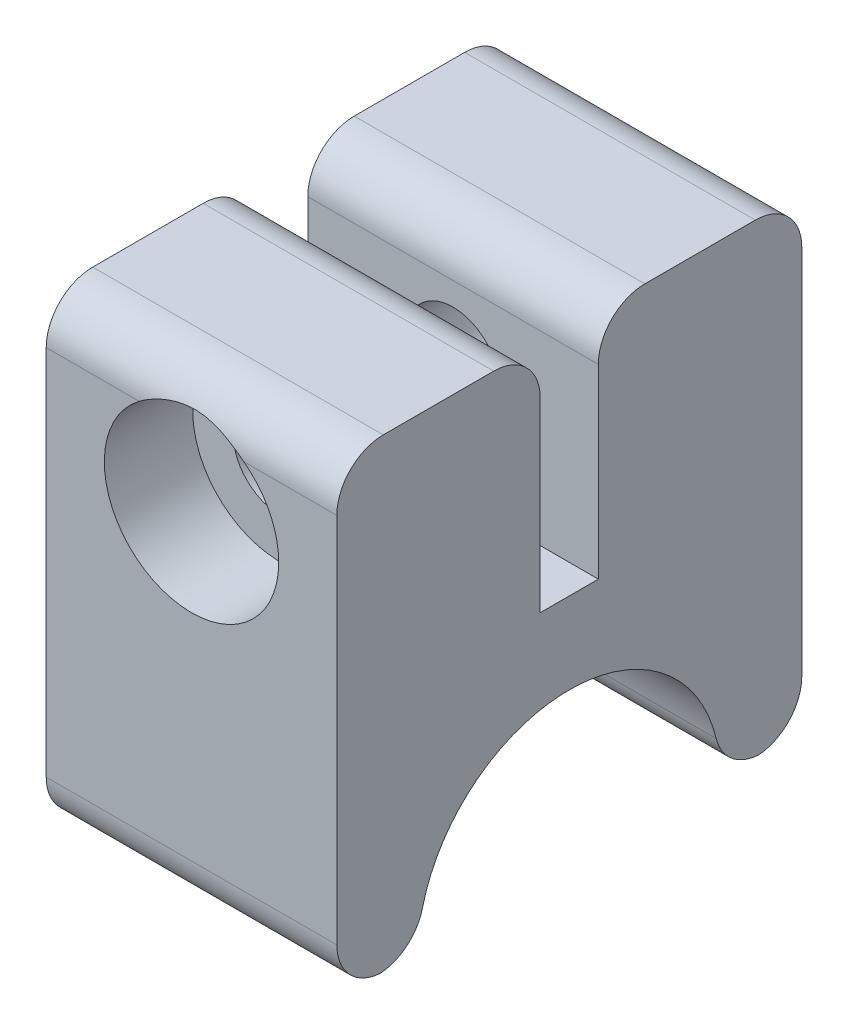
ISO-10303-21;
HEADER;
FILE_DESCRIPTION(('STEP AP214'),'2;1');
FILE_NAME('part.step','',(''),(''),'','','');
FILE_SCHEMA(('AUTOMOTIVE_DESIGN { 1 0 10303 214 1 1 1 1 }'));
ENDSEC;
DATA;
#1=APPLICATION_CONTEXT('core data for automotive mechanical design processes');
#2=APPLICATION_PROTOCOL_DEFINITION('international standard','automotive_design',2000,#1);
#3=PRODUCT_CONTEXT('',#1,'mechanical');
#4=PRODUCT('Part','Part','',(#3));
#5=PRODUCT_RELATED_PRODUCT_CATEGORY('part','',(#4));
#6=PRODUCT_DEFINITION_FORMATION('','',#4);
#7=PRODUCT_DEFINITION_CONTEXT('part definition',#1,'design');
#8=PRODUCT_DEFINITION('design','',#6,#7);
#9=PRODUCT_DEFINITION_SHAPE('','',#8);
#10=(LENGTH_UNIT() NAMED_UNIT(*) SI_UNIT(.MILLI.,.METRE.));
#11=(NAMED_UNIT(*) PLANE_ANGLE_UNIT() SI_UNIT($,.RADIAN.));
#12=(NAMED_UNIT(*) SI_UNIT($,.STERADIAN.) SOLID_ANGLE_UNIT());
#13=UNCERTAINTY_MEASURE_WITH_UNIT(LENGTH_MEASURE(1.E-05),#10,'distance_accuracy_value','');
#14=(GEOMETRIC_REPRESENTATION_CONTEXT(3) GLOBAL_UNCERTAINTY_ASSIGNED_CONTEXT((#13)) GLOBAL_UNIT_ASSIGNED_CONTEXT((#10,
#11,#12)) REPRESENTATION_CONTEXT('',''));
#15=CARTESIAN_POINT('',(0.,0.,0.));
#16=DIRECTION('',(0.,0.,1.));
#17=DIRECTION('',(1.,0.,0.));
#18=AXIS2_PLACEMENT_3D('',#15,#16,#17);
#19=CARTESIAN_POINT('',(0.,6.35,12.7));
#20=DIRECTION('',(0.,0.,1.));
#21=DIRECTION('',(1.,0.,0.));
#22=AXIS2_PLACEMENT_3D('',#19,#20,#21);
#23=CYLINDRICAL_SURFACE('',#22,2.5527);
#24=CARTESIAN_POINT('',(0.,6.35,-1.5875));
#25=DIRECTION('',(0.,0.,-1.));
#26=DIRECTION('',(-1.,0.,0.));
#27=AXIS2_PLACEMENT_3D('',#24,#25,#26);
#28=CIRCLE('',#27,2.5527);
#29=CARTESIAN_POINT('',(-2.5527,6.35,-1.5875));
#30=VERTEX_POINT('',#29);
#31=EDGE_CURVE('E262',#30,#30,#28,.T.);
#32=ORIENTED_EDGE('',*,*,#31,.F.);
#33=EDGE_LOOP('',(#32));
#34=FACE_BOUND('',#33,.T.);
#35=CARTESIAN_POINT('',(0.,6.35,-6.492875));
#36=DIRECTION('',(0.,0.,-1.));
#37=DIRECTION('',(-1.,0.,0.));
#38=AXIS2_PLACEMENT_3D('',#35,#36,#37);
#39=CIRCLE('',#38,2.5527);
#40=CARTESIAN_POINT('',(-2.5527,6.35,-6.492875));
#41=VERTEX_POINT('',#40);
#42=EDGE_CURVE('E41',#41,#41,#39,.F.);
#43=ORIENTED_EDGE('',*,*,#42,.F.);
#44=EDGE_LOOP('',(#43));
#45=FACE_BOUND('',#44,.T.);
#46=ADVANCED_FACE('F37',(#34,#45),#23,.F.);
#47=CARTESIAN_POINT('',(-7.9375,12.7,12.7));
#48=DIRECTION('',(0.,-1.,0.));
#49=DIRECTION('',(0.,0.,-1.));
#50=AXIS2_PLACEMENT_3D('',#47,#48,#49);
#51=PLANE('',#50);
#52=DIRECTION('',(0.,0.,-1.));
#53=VECTOR('',#52,1.);
#54=CARTESIAN_POINT('',(-7.9375,12.7,12.7));
#55=LINE('',#54,#53);
#56=CARTESIAN_POINT('',(-7.9375,12.7,10.16));
#57=VERTEX_POINT('',#56);
#58=CARTESIAN_POINT('',(-7.9375,12.7,4.1275));
#59=VERTEX_POINT('',#58);
#60=EDGE_CURVE('E308',#57,#59,#55,.T.);
#61=ORIENTED_EDGE('',*,*,#60,.F.);
#62=DIRECTION('',(-1.,0.,0.));
#63=VECTOR('',#62,1.);
#64=CARTESIAN_POINT('',(-7.9375,12.7,10.16));
#65=LINE('',#64,#63);
#66=CARTESIAN_POINT('',(7.9375,12.7,10.16));
#67=VERTEX_POINT('',#66);
#68=EDGE_CURVE('E470',#57,#67,#65,.F.);
#69=ORIENTED_EDGE('',*,*,#68,.T.);
#70=DIRECTION('',(0.,0.,-1.));
#71=VECTOR('',#70,1.);
#72=CARTESIAN_POINT('',(7.9375,12.7,12.7));
#73=LINE('',#72,#71);
#74=CARTESIAN_POINT('',(7.9375,12.7,4.1275));
#75=VERTEX_POINT('',#74);
#76=EDGE_CURVE('E312',#67,#75,#73,.T.);
#77=ORIENTED_EDGE('',*,*,#76,.T.);
#78=DIRECTION('',(1.,0.,0.));
#79=VECTOR('',#78,1.);
#80=CARTESIAN_POINT('',(-7.9375,12.7,4.1275));
#81=LINE('',#80,#79);
#82=EDGE_CURVE('E468',#75,#59,#81,.F.);
#83=ORIENTED_EDGE('',*,*,#82,.T.);
#84=EDGE_LOOP('',(#61,#69,#77,#83));
#85=FACE_BOUND('',#84,.T.);
#86=ADVANCED_FACE('F384',(#85),#51,.F.);
#87=CARTESIAN_POINT('',(7.9375,-12.7,12.7));
#88=DIRECTION('',(-1.,0.,0.));
#89=DIRECTION('',(0.,0.,1.));
#90=AXIS2_PLACEMENT_3D('',#87,#88,#89);
#91=PLANE('',#90);
#92=ORIENTED_EDGE('',*,*,#76,.F.);
#93=CARTESIAN_POINT('',(7.9375,10.16,10.16));
#94=DIRECTION('',(-1.,0.,0.));
#95=DIRECTION('',(0.,0.,1.));
#96=AXIS2_PLACEMENT_3D('',#93,#94,#95);
#97=CIRCLE('',#96,2.54);
#98=CARTESIAN_POINT('',(7.9375,10.16,12.7));
#99=VERTEX_POINT('',#98);
#100=EDGE_CURVE('E484',#67,#99,#97,.F.);
#101=ORIENTED_EDGE('',*,*,#100,.T.);
#102=DIRECTION('',(0.,1.,0.));
#103=VECTOR('',#102,1.);
#104=CARTESIAN_POINT('',(7.9375,-12.7,12.7));
#105=LINE('',#104,#103);
#106=CARTESIAN_POINT('',(7.9375,-10.16,12.7));
#107=VERTEX_POINT('',#106);
#108=EDGE_CURVE('E294',#107,#99,#105,.T.);
#109=ORIENTED_EDGE('',*,*,#108,.F.);
#110=CARTESIAN_POINT('',(7.9375,-10.16,10.16));
#111=DIRECTION('',(-1.,0.,0.));
#112=DIRECTION('',(0.,0.,1.));
#113=AXIS2_PLACEMENT_3D('',#110,#111,#112);
#114=CIRCLE('',#113,2.54);
#115=CARTESIAN_POINT('',(7.9375,-12.6945723434746,10.32596094629));
#116=VERTEX_POINT('',#115);
#117=EDGE_CURVE('E61',#107,#116,#114,.F.);
#118=ORIENTED_EDGE('',*,*,#117,.T.);
#119=CARTESIAN_POINT('',(7.9375,-10.16,10.49192189258));
#120=DIRECTION('',(-1.,0.,0.));
#121=DIRECTION('',(0.,0.,1.));
#122=AXIS2_PLACEMENT_3D('',#119,#120,#121);
#123=CIRCLE('',#122,2.54);
#124=CARTESIAN_POINT('',(7.9375,-10.7576470588235,8.02323438844355));
#125=VERTEX_POINT('',#124);
#126=EDGE_CURVE('E476',#116,#125,#123,.F.);
#127=ORIENTED_EDGE('',*,*,#126,.T.);
#128=CARTESIAN_POINT('',(7.9375,-12.7,0.));
#129=DIRECTION('',(1.,0.,0.));
#130=DIRECTION('',(0.,0.,-1.));
#131=AXIS2_PLACEMENT_3D('',#128,#129,#130);
#132=CIRCLE('',#131,8.255);
#133=CARTESIAN_POINT('',(7.9375,-10.7576470588235,-8.02323438844355));
#134=VERTEX_POINT('',#133);
#135=EDGE_CURVE('E280',#134,#125,#132,.T.);
#136=ORIENTED_EDGE('',*,*,#135,.F.);
#137=CARTESIAN_POINT('',(7.9375,-10.16,-10.49192189258));
#138=DIRECTION('',(-1.,0.,0.));
#139=DIRECTION('',(0.,0.,1.));
#140=AXIS2_PLACEMENT_3D('',#137,#138,#139);
#141=CIRCLE('',#140,2.54);
#142=CARTESIAN_POINT('',(7.9375,-12.6945723434746,-10.32596094629));
#143=VERTEX_POINT('',#142);
#144=EDGE_CURVE('E472',#134,#143,#141,.F.);
#145=ORIENTED_EDGE('',*,*,#144,.T.);
#146=CARTESIAN_POINT('',(7.9375,-10.16,-10.16));
#147=DIRECTION('',(-1.,0.,0.));
#148=DIRECTION('',(0.,0.,1.));
#149=AXIS2_PLACEMENT_3D('',#146,#147,#148);
#150=CIRCLE('',#149,2.54);
#151=CARTESIAN_POINT('',(7.9375,-10.16,-12.7));
#152=VERTEX_POINT('',#151);
#153=EDGE_CURVE('E474',#143,#152,#150,.F.);
#154=ORIENTED_EDGE('',*,*,#153,.T.);
#155=DIRECTION('',(0.,1.,0.));
#156=VECTOR('',#155,1.);
#157=CARTESIAN_POINT('',(7.9375,-12.7,-12.7));
#158=LINE('',#157,#156);
#159=CARTESIAN_POINT('',(7.9375,10.16,-12.7));
#160=VERTEX_POINT('',#159);
#161=EDGE_CURVE('E287',#152,#160,#158,.T.);
#162=ORIENTED_EDGE('',*,*,#161,.T.);
#163=CARTESIAN_POINT('',(7.9375,10.16,-10.16));
#164=DIRECTION('',(-1.,0.,0.));
#165=DIRECTION('',(0.,0.,1.));
#166=AXIS2_PLACEMENT_3D('',#163,#164,#165);
#167=CIRCLE('',#166,2.54);
#168=CARTESIAN_POINT('',(7.9375,12.7,-10.16));
#169=VERTEX_POINT('',#168);
#170=EDGE_CURVE('E426',#160,#169,#167,.F.);
#171=ORIENTED_EDGE('',*,*,#170,.T.);
#172=CARTESIAN_POINT('',(7.9375,12.7,-4.1275));
#173=VERTEX_POINT('',#172);
#174=EDGE_CURVE('E309',#173,#169,#73,.T.);
#175=ORIENTED_EDGE('',*,*,#174,.F.);
#176=CARTESIAN_POINT('',(7.9375,10.16,-4.1275));
#177=DIRECTION('',(-1.,0.,0.));
#178=DIRECTION('',(0.,0.,1.));
#179=AXIS2_PLACEMENT_3D('',#176,#177,#178);
#180=CIRCLE('',#179,2.54);
#181=CARTESIAN_POINT('',(7.9375,10.16,-1.5875));
#182=VERTEX_POINT('',#181);
#183=EDGE_CURVE('E481',#173,#182,#180,.F.);
#184=ORIENTED_EDGE('',*,*,#183,.T.);
#185=DIRECTION('',(0.,1.,0.));
#186=VECTOR('',#185,1.);
#187=CARTESIAN_POINT('',(7.9375,12.7,-1.5875));
#188=LINE('',#187,#186);
#189=CARTESIAN_POINT('',(7.9375,0.,-1.5875));
#190=VERTEX_POINT('',#189);
#191=EDGE_CURVE('E270',#190,#182,#188,.T.);
#192=ORIENTED_EDGE('',*,*,#191,.F.);
#193=DIRECTION('',(0.,0.,-1.));
#194=VECTOR('',#193,1.);
#195=CARTESIAN_POINT('',(7.9375,0.,1.5875));
#196=LINE('',#195,#194);
#197=CARTESIAN_POINT('',(7.9375,0.,1.5875));
#198=VERTEX_POINT('',#197);
#199=EDGE_CURVE('E279',#198,#190,#196,.T.);
#200=ORIENTED_EDGE('',*,*,#199,.F.);
#201=DIRECTION('',(0.,-1.,0.));
#202=VECTOR('',#201,1.);
#203=CARTESIAN_POINT('',(7.9375,12.7,1.5875));
#204=LINE('',#203,#202);
#205=CARTESIAN_POINT('',(7.9375,10.16,1.5875));
#206=VERTEX_POINT('',#205);
#207=EDGE_CURVE('E277',#206,#198,#204,.T.);
#208=ORIENTED_EDGE('',*,*,#207,.F.);
#209=CARTESIAN_POINT('',(7.9375,10.16,4.1275));
#210=DIRECTION('',(-1.,0.,0.));
#211=DIRECTION('',(0.,0.,1.));
#212=AXIS2_PLACEMENT_3D('',#209,#210,#211);
#213=CIRCLE('',#212,2.54);
#214=EDGE_CURVE('E479',#206,#75,#213,.F.);
#215=ORIENTED_EDGE('',*,*,#214,.T.);
#216=EDGE_LOOP('',(#92,#101,#109,#118,#127,#136,#145,#154,#162,#171,#175,#184,#192,#200,#208,#215));
#217=FACE_BOUND('',#216,.T.);
#218=ADVANCED_FACE('F382',(#217),#91,.F.);
#219=ORIENTED_EDGE('',*,*,#174,.T.);
#220=DIRECTION('',(-1.,0.,0.));
#221=VECTOR('',#220,1.);
#222=CARTESIAN_POINT('',(-7.9375,12.7,-10.16));
#223=LINE('',#222,#221);
#224=CARTESIAN_POINT('',(-7.9375,12.7,-10.16));
#225=VERTEX_POINT('',#224);
#226=EDGE_CURVE('E434',#169,#225,#223,.T.);
#227=ORIENTED_EDGE('',*,*,#226,.T.);
#228=CARTESIAN_POINT('',(-7.9375,12.7,-4.1275));
#229=VERTEX_POINT('',#228);
#230=EDGE_CURVE('E301',#229,#225,#55,.T.);
#231=ORIENTED_EDGE('',*,*,#230,.F.);
#232=DIRECTION('',(1.,0.,0.));
#233=VECTOR('',#232,1.);
#234=CARTESIAN_POINT('',(-7.9375,12.7,-4.1275));
#235=LINE('',#234,#233);
#236=EDGE_CURVE('E486',#229,#173,#235,.T.);
#237=ORIENTED_EDGE('',*,*,#236,.T.);
#238=EDGE_LOOP('',(#219,#227,#231,#237));
#239=FACE_BOUND('',#238,.T.);
#240=ADVANCED_FACE('F379',(#239),#51,.F.);
#241=CARTESIAN_POINT('',(-7.9375,-12.7,12.7));
#242=DIRECTION('',(1.,0.,0.));
#243=DIRECTION('',(0.,0.,-1.));
#244=AXIS2_PLACEMENT_3D('',#241,#242,#243);
#245=PLANE('',#244);
#246=DIRECTION('',(0.,-1.,0.));
#247=VECTOR('',#246,1.);
#248=CARTESIAN_POINT('',(-7.9375,-12.7,12.7));
#249=LINE('',#248,#247);
#250=CARTESIAN_POINT('',(-7.9375,10.16,12.7));
#251=VERTEX_POINT('',#250);
#252=CARTESIAN_POINT('',(-7.9375,-10.16,12.7));
#253=VERTEX_POINT('',#252);
#254=EDGE_CURVE('E297',#251,#253,#249,.T.);
#255=ORIENTED_EDGE('',*,*,#254,.F.);
#256=CARTESIAN_POINT('',(-7.9375,10.16,10.16));
#257=DIRECTION('',(1.,0.,0.));
#258=DIRECTION('',(0.,0.,-1.));
#259=AXIS2_PLACEMENT_3D('',#256,#257,#258);
#260=CIRCLE('',#259,2.54);
#261=EDGE_CURVE('E466',#251,#57,#260,.F.);
#262=ORIENTED_EDGE('',*,*,#261,.T.);
#263=ORIENTED_EDGE('',*,*,#60,.T.);
#264=CARTESIAN_POINT('',(-7.9375,10.16,4.1275));
#265=DIRECTION('',(1.,0.,0.));
#266=DIRECTION('',(0.,0.,-1.));
#267=AXIS2_PLACEMENT_3D('',#264,#265,#266);
#268=CIRCLE('',#267,2.54);
#269=CARTESIAN_POINT('',(-7.9375,10.16,1.5875));
#270=VERTEX_POINT('',#269);
#271=EDGE_CURVE('E458',#59,#270,#268,.F.);
#272=ORIENTED_EDGE('',*,*,#271,.T.);
#273=DIRECTION('',(0.,-1.,0.));
#274=VECTOR('',#273,1.);
#275=CARTESIAN_POINT('',(-7.9375,12.7,1.5875));
#276=LINE('',#275,#274);
#277=CARTESIAN_POINT('',(-7.9375,0.,1.5875));
#278=VERTEX_POINT('',#277);
#279=EDGE_CURVE('E267',#270,#278,#276,.T.);
#280=ORIENTED_EDGE('',*,*,#279,.T.);
#281=DIRECTION('',(0.,0.,-1.));
#282=VECTOR('',#281,1.);
#283=CARTESIAN_POINT('',(-7.9375,0.,1.5875));
#284=LINE('',#283,#282);
#285=CARTESIAN_POINT('',(-7.9375,0.,-1.5875));
#286=VERTEX_POINT('',#285);
#287=EDGE_CURVE('E269',#278,#286,#284,.T.);
#288=ORIENTED_EDGE('',*,*,#287,.T.);
#289=DIRECTION('',(0.,1.,0.));
#290=VECTOR('',#289,1.);
#291=CARTESIAN_POINT('',(-7.9375,12.7,-1.5875));
#292=LINE('',#291,#290);
#293=CARTESIAN_POINT('',(-7.9375,10.16,-1.5875));
#294=VERTEX_POINT('',#293);
#295=EDGE_CURVE('E273',#286,#294,#292,.T.);
#296=ORIENTED_EDGE('',*,*,#295,.T.);
#297=CARTESIAN_POINT('',(-7.9375,10.16,-4.1275));
#298=DIRECTION('',(1.,0.,0.));
#299=DIRECTION('',(0.,0.,-1.));
#300=AXIS2_PLACEMENT_3D('',#297,#298,#299);
#301=CIRCLE('',#300,2.54);
#302=EDGE_CURVE('E462',#294,#229,#301,.F.);
#303=ORIENTED_EDGE('',*,*,#302,.T.);
#304=ORIENTED_EDGE('',*,*,#230,.T.);
#305=CARTESIAN_POINT('',(-7.9375,10.16,-10.16));
#306=DIRECTION('',(1.,0.,0.));
#307=DIRECTION('',(0.,0.,-1.));
#308=AXIS2_PLACEMENT_3D('',#305,#306,#307);
#309=CIRCLE('',#308,2.54);
#310=CARTESIAN_POINT('',(-7.9375,10.16,-12.7));
#311=VERTEX_POINT('',#310);
#312=EDGE_CURVE('E464',#225,#311,#309,.F.);
#313=ORIENTED_EDGE('',*,*,#312,.T.);
#314=DIRECTION('',(0.,-1.,0.));
#315=VECTOR('',#314,1.);
#316=CARTESIAN_POINT('',(-7.9375,-12.7,-12.7));
#317=LINE('',#316,#315);
#318=CARTESIAN_POINT('',(-7.9375,-10.16,-12.7));
#319=VERTEX_POINT('',#318);
#320=EDGE_CURVE('E298',#311,#319,#317,.T.);
#321=ORIENTED_EDGE('',*,*,#320,.T.);
#322=CARTESIAN_POINT('',(-7.9375,-10.16,-10.16));
#323=DIRECTION('',(1.,0.,0.));
#324=DIRECTION('',(0.,0.,-1.));
#325=AXIS2_PLACEMENT_3D('',#322,#323,#324);
#326=CIRCLE('',#325,2.54);
#327=CARTESIAN_POINT('',(-7.9375,-12.6945723434746,-10.32596094629));
#328=VERTEX_POINT('',#327);
#329=EDGE_CURVE('E456',#319,#328,#326,.F.);
#330=ORIENTED_EDGE('',*,*,#329,.T.);
#331=CARTESIAN_POINT('',(-7.9375,-10.16,-10.49192189258));
#332=DIRECTION('',(1.,0.,0.));
#333=DIRECTION('',(0.,0.,-1.));
#334=AXIS2_PLACEMENT_3D('',#331,#332,#333);
#335=CIRCLE('',#334,2.54);
#336=CARTESIAN_POINT('',(-7.9375,-10.7576470588235,-8.02323438844355));
#337=VERTEX_POINT('',#336);
#338=EDGE_CURVE('E331',#328,#337,#335,.F.);
#339=ORIENTED_EDGE('',*,*,#338,.T.);
#340=CARTESIAN_POINT('',(-7.9375,-12.7,0.));
#341=DIRECTION('',(1.,0.,0.));
#342=DIRECTION('',(0.,0.,-1.));
#343=AXIS2_PLACEMENT_3D('',#340,#341,#342);
#344=CIRCLE('',#343,8.255);
#345=CARTESIAN_POINT('',(-7.9375,-10.7576470588235,8.02323438844355));
#346=VERTEX_POINT('',#345);
#347=EDGE_CURVE('E266',#337,#346,#344,.T.);
#348=ORIENTED_EDGE('',*,*,#347,.T.);
#349=CARTESIAN_POINT('',(-7.9375,-10.16,10.49192189258));
#350=DIRECTION('',(1.,0.,0.));
#351=DIRECTION('',(0.,0.,-1.));
#352=AXIS2_PLACEMENT_3D('',#349,#350,#351);
#353=CIRCLE('',#352,2.54);
#354=CARTESIAN_POINT('',(-7.9375,-12.6945723434746,10.32596094629));
#355=VERTEX_POINT('',#354);
#356=EDGE_CURVE('E450',#346,#355,#353,.F.);
#357=ORIENTED_EDGE('',*,*,#356,.T.);
#358=CARTESIAN_POINT('',(-7.9375,-10.16,10.16));
#359=DIRECTION('',(1.,0.,0.));
#360=DIRECTION('',(0.,0.,-1.));
#361=AXIS2_PLACEMENT_3D('',#358,#359,#360);
#362=CIRCLE('',#361,2.54);
#363=EDGE_CURVE('E455',#355,#253,#362,.F.);
#364=ORIENTED_EDGE('',*,*,#363,.T.);
#365=EDGE_LOOP('',(#255,#262,#263,#272,#280,#288,#296,#303,#304,#313,#321,#330,#339,#348,#357,#364));
#366=FACE_BOUND('',#365,.T.);
#367=ADVANCED_FACE('F372',(#366),#245,.F.);
#368=CARTESIAN_POINT('',(0.,0.,12.7));
#369=DIRECTION('',(0.,0.,-1.));
#370=DIRECTION('',(-1.,0.,0.));
#371=AXIS2_PLACEMENT_3D('',#368,#369,#370);
#372=PLANE('',#371);
#373=ORIENTED_EDGE('',*,*,#108,.T.);
#374=DIRECTION('',(-1.,0.,0.));
#375=VECTOR('',#374,1.);
#376=CARTESIAN_POINT('',(0.,10.16,12.7));
#377=LINE('',#376,#375);
#378=CARTESIAN_POINT('',(2.8575,10.16,12.7));
#379=VERTEX_POINT('',#378);
#380=EDGE_CURVE('E320',#99,#379,#377,.T.);
#381=ORIENTED_EDGE('',*,*,#380,.T.);
#382=CARTESIAN_POINT('',(0.,6.35,12.7));
#383=DIRECTION('',(0.,0.,1.));
#384=DIRECTION('',(1.,0.,0.));
#385=AXIS2_PLACEMENT_3D('',#382,#383,#384);
#386=CIRCLE('',#385,4.7625);
#387=CARTESIAN_POINT('',(-2.8575,10.16,12.7));
#388=VERTEX_POINT('',#387);
#389=EDGE_CURVE('E252',#388,#379,#386,.T.);
#390=ORIENTED_EDGE('',*,*,#389,.F.);
#391=DIRECTION('',(-1.,0.,0.));
#392=VECTOR('',#391,1.);
#393=CARTESIAN_POINT('',(0.,10.16,12.7));
#394=LINE('',#393,#392);
#395=EDGE_CURVE('E318',#388,#251,#394,.T.);
#396=ORIENTED_EDGE('',*,*,#395,.T.);
#397=ORIENTED_EDGE('',*,*,#254,.T.);
#398=DIRECTION('',(1.,0.,0.));
#399=VECTOR('',#398,1.);
#400=CARTESIAN_POINT('',(0.,-10.16,12.7));
#401=LINE('',#400,#399);
#402=EDGE_CURVE('E315',#253,#107,#401,.T.);
#403=ORIENTED_EDGE('',*,*,#402,.T.);
#404=EDGE_LOOP('',(#373,#381,#390,#396,#397,#403));
#405=FACE_BOUND('',#404,.T.);
#406=ADVANCED_FACE('F369',(#405),#372,.F.);
#407=CARTESIAN_POINT('',(0.,0.,-12.7));
#408=DIRECTION('',(0.,0.,-1.));
#409=DIRECTION('',(-1.,0.,0.));
#410=AXIS2_PLACEMENT_3D('',#407,#408,#409);
#411=PLANE('',#410);
#412=DIRECTION('',(0.5,-0.866025403784438,0.));
#413=VECTOR('',#412,1.);
#414=CARTESIAN_POINT('',(2.82295414120267,11.2395,-12.7));
#415=LINE('',#414,#413);
#416=CARTESIAN_POINT('',(3.44620375679287,10.16,-12.7));
#417=VERTEX_POINT('',#416);
#418=CARTESIAN_POINT('',(5.64590828240535,6.35,-12.7));
#419=VERTEX_POINT('',#418);
#420=EDGE_CURVE('E237',#417,#419,#415,.T.);
#421=ORIENTED_EDGE('',*,*,#420,.F.);
#422=DIRECTION('',(-1.,0.,0.));
#423=VECTOR('',#422,1.);
#424=CARTESIAN_POINT('',(7.9375,10.16,-12.7));
#425=LINE('',#424,#423);
#426=EDGE_CURVE('E424',#417,#160,#425,.F.);
#427=ORIENTED_EDGE('',*,*,#426,.T.);
#428=ORIENTED_EDGE('',*,*,#161,.F.);
#429=DIRECTION('',(1.,0.,0.));
#430=VECTOR('',#429,1.);
#431=CARTESIAN_POINT('',(-7.9375,-10.16,-12.7));
#432=LINE('',#431,#430);
#433=EDGE_CURVE('E429',#152,#319,#432,.F.);
#434=ORIENTED_EDGE('',*,*,#433,.T.);
#435=ORIENTED_EDGE('',*,*,#320,.F.);
#436=CARTESIAN_POINT('',(-3.44620375679288,10.16,-12.7));
#437=VERTEX_POINT('',#436);
#438=EDGE_CURVE('E428',#311,#437,#425,.F.);
#439=ORIENTED_EDGE('',*,*,#438,.T.);
#440=DIRECTION('',(0.5,0.866025403784439,0.));
#441=VECTOR('',#440,1.);
#442=CARTESIAN_POINT('',(-5.64590828240535,6.35,-12.7));
#443=LINE('',#442,#441);
#444=CARTESIAN_POINT('',(-5.64590828240535,6.35,-12.7));
#445=VERTEX_POINT('',#444);
#446=EDGE_CURVE('E53',#445,#437,#443,.T.);
#447=ORIENTED_EDGE('',*,*,#446,.F.);
#448=DIRECTION('',(-0.5,0.866025403784439,0.));
#449=VECTOR('',#448,1.);
#450=CARTESIAN_POINT('',(-2.82295414120268,1.4605,-12.7));
#451=LINE('',#450,#449);
#452=CARTESIAN_POINT('',(-2.82295414120268,1.4605,-12.7));
#453=VERTEX_POINT('',#452);
#454=EDGE_CURVE('E205',#453,#445,#451,.T.);
#455=ORIENTED_EDGE('',*,*,#454,.F.);
#456=DIRECTION('',(-1.,0.,0.));
#457=VECTOR('',#456,1.);
#458=CARTESIAN_POINT('',(2.82295414120268,1.4605,-12.7));
#459=LINE('',#458,#457);
#460=CARTESIAN_POINT('',(2.82295414120268,1.4605,-12.7));
#461=VERTEX_POINT('',#460);
#462=EDGE_CURVE('E222',#461,#453,#459,.T.);
#463=ORIENTED_EDGE('',*,*,#462,.F.);
#464=DIRECTION('',(-0.5,-0.866025403784439,0.));
#465=VECTOR('',#464,1.);
#466=CARTESIAN_POINT('',(5.64590828240535,6.35,-12.7));
#467=LINE('',#466,#465);
#468=EDGE_CURVE('E225',#419,#461,#467,.T.);
#469=ORIENTED_EDGE('',*,*,#468,.F.);
#470=EDGE_LOOP('',(#421,#427,#428,#434,#435,#439,#447,#455,#463,#469));
#471=FACE_BOUND('',#470,.T.);
#472=ADVANCED_FACE('F367',(#471),#411,.T.);
#473=CARTESIAN_POINT('',(-7.9375,-12.7,0.));
#474=DIRECTION('',(1.,0.,0.));
#475=DIRECTION('',(0.,0.,-1.));
#476=AXIS2_PLACEMENT_3D('',#473,#474,#475);
#477=CYLINDRICAL_SURFACE('',#476,8.255);
#478=ORIENTED_EDGE('',*,*,#135,.T.);
#479=DIRECTION('',(1.,0.,0.));
#480=VECTOR('',#479,1.);
#481=CARTESIAN_POINT('',(-7.9375,-10.7576470588235,8.02323438844355));
#482=LINE('',#481,#480);
#483=EDGE_CURVE('E411',#125,#346,#482,.F.);
#484=ORIENTED_EDGE('',*,*,#483,.T.);
#485=ORIENTED_EDGE('',*,*,#347,.F.);
#486=DIRECTION('',(1.,0.,0.));
#487=VECTOR('',#486,1.);
#488=CARTESIAN_POINT('',(-7.9375,-10.7576470588235,-8.02323438844355));
#489=LINE('',#488,#487);
#490=EDGE_CURVE('E442',#337,#134,#489,.T.);
#491=ORIENTED_EDGE('',*,*,#490,.T.);
#492=EDGE_LOOP('',(#478,#484,#485,#491));
#493=FACE_BOUND('',#492,.T.);
#494=ADVANCED_FACE('F363',(#493),#477,.F.);
#495=CARTESIAN_POINT('',(-7.9375,12.7,1.5875));
#496=DIRECTION('',(0.,0.,1.));
#497=DIRECTION('',(1.,0.,0.));
#498=AXIS2_PLACEMENT_3D('',#495,#496,#497);
#499=PLANE('',#498);
#500=CARTESIAN_POINT('',(0.,6.35,1.5875));
#501=DIRECTION('',(0.,0.,1.));
#502=DIRECTION('',(1.,0.,0.));
#503=AXIS2_PLACEMENT_3D('',#500,#501,#502);
#504=CIRCLE('',#503,2.5527);
#505=CARTESIAN_POINT('',(2.5527,6.35,1.5875));
#506=VERTEX_POINT('',#505);
#507=EDGE_CURVE('E263',#506,#506,#504,.T.);
#508=ORIENTED_EDGE('',*,*,#507,.T.);
#509=EDGE_LOOP('',(#508));
#510=FACE_BOUND('',#509,.T.);
#511=ORIENTED_EDGE('',*,*,#279,.F.);
#512=DIRECTION('',(1.,0.,0.));
#513=VECTOR('',#512,1.);
#514=CARTESIAN_POINT('',(-7.9375,10.16,1.5875));
#515=LINE('',#514,#513);
#516=EDGE_CURVE('E439',#270,#206,#515,.T.);
#517=ORIENTED_EDGE('',*,*,#516,.T.);
#518=ORIENTED_EDGE('',*,*,#207,.T.);
#519=DIRECTION('',(1.,0.,0.));
#520=VECTOR('',#519,1.);
#521=CARTESIAN_POINT('',(-7.9375,0.,1.5875));
#522=LINE('',#521,#520);
#523=EDGE_CURVE('E276',#278,#198,#522,.T.);
#524=ORIENTED_EDGE('',*,*,#523,.F.);
#525=EDGE_LOOP('',(#511,#517,#518,#524));
#526=FACE_BOUND('',#525,.T.);
#527=ADVANCED_FACE('F356',(#510,#526),#499,.F.);
#528=CARTESIAN_POINT('',(-7.9375,12.7,-1.5875));
#529=DIRECTION('',(0.,0.,-1.));
#530=DIRECTION('',(-1.,0.,0.));
#531=AXIS2_PLACEMENT_3D('',#528,#529,#530);
#532=PLANE('',#531);
#533=ORIENTED_EDGE('',*,*,#31,.T.);
#534=EDGE_LOOP('',(#533));
#535=FACE_BOUND('',#534,.T.);
#536=ORIENTED_EDGE('',*,*,#191,.T.);
#537=DIRECTION('',(1.,0.,0.));
#538=VECTOR('',#537,1.);
#539=CARTESIAN_POINT('',(-7.9375,10.16,-1.5875));
#540=LINE('',#539,#538);
#541=EDGE_CURVE('E432',#182,#294,#540,.F.);
#542=ORIENTED_EDGE('',*,*,#541,.T.);
#543=ORIENTED_EDGE('',*,*,#295,.F.);
#544=DIRECTION('',(1.,0.,0.));
#545=VECTOR('',#544,1.);
#546=CARTESIAN_POINT('',(-7.9375,0.,-1.5875));
#547=LINE('',#546,#545);
#548=EDGE_CURVE('E285',#286,#190,#547,.T.);
#549=ORIENTED_EDGE('',*,*,#548,.T.);
#550=EDGE_LOOP('',(#536,#542,#543,#549));
#551=FACE_BOUND('',#550,.T.);
#552=ADVANCED_FACE('F353',(#535,#551),#532,.F.);
#553=CARTESIAN_POINT('',(-7.9375,0.,1.5875));
#554=DIRECTION('',(0.,-1.,0.));
#555=DIRECTION('',(0.,0.,-1.));
#556=AXIS2_PLACEMENT_3D('',#553,#554,#555);
#557=PLANE('',#556);
#558=ORIENTED_EDGE('',*,*,#199,.T.);
#559=ORIENTED_EDGE('',*,*,#548,.F.);
#560=ORIENTED_EDGE('',*,*,#287,.F.);
#561=ORIENTED_EDGE('',*,*,#523,.T.);
#562=EDGE_LOOP('',(#558,#559,#560,#561));
#563=FACE_BOUND('',#562,.T.);
#564=ADVANCED_FACE('F351',(#563),#557,.F.);
#565=CARTESIAN_POINT('',(0.,6.35,7.874));
#566=DIRECTION('',(0.,0.,1.));
#567=DIRECTION('',(1.,0.,0.));
#568=AXIS2_PLACEMENT_3D('',#565,#566,#567);
#569=CIRCLE('',#568,2.5527);
#570=CARTESIAN_POINT('',(2.5527,6.35,7.874));
#571=VERTEX_POINT('',#570);
#572=EDGE_CURVE('E259',#571,#571,#569,.T.);
#573=ORIENTED_EDGE('',*,*,#572,.T.);
#574=EDGE_LOOP('',(#573));
#575=FACE_BOUND('',#574,.T.);
#576=ORIENTED_EDGE('',*,*,#507,.F.);
#577=EDGE_LOOP('',(#576));
#578=FACE_BOUND('',#577,.T.);
#579=ADVANCED_FACE('F347',(#575,#578),#23,.F.);
#580=CARTESIAN_POINT('',(2.5527,6.35,7.874));
#581=DIRECTION('',(0.,0.,-1.));
#582=DIRECTION('',(-1.,0.,0.));
#583=AXIS2_PLACEMENT_3D('',#580,#581,#582);
#584=PLANE('',#583);
#585=ORIENTED_EDGE('',*,*,#572,.F.);
#586=EDGE_LOOP('',(#585));
#587=FACE_BOUND('',#586,.T.);
#588=CARTESIAN_POINT('',(0.,6.35,7.874));
#589=DIRECTION('',(0.,0.,1.));
#590=DIRECTION('',(1.,0.,0.));
#591=AXIS2_PLACEMENT_3D('',#588,#589,#590);
#592=CIRCLE('',#591,4.7625);
#593=CARTESIAN_POINT('',(4.7625,6.35,7.874));
#594=VERTEX_POINT('',#593);
#595=EDGE_CURVE('E255',#594,#594,#592,.T.);
#596=ORIENTED_EDGE('',*,*,#595,.T.);
#597=EDGE_LOOP('',(#596));
#598=FACE_BOUND('',#597,.T.);
#599=ADVANCED_FACE('F342',(#587,#598),#584,.F.);
#600=CARTESIAN_POINT('',(0.,6.35,12.7));
#601=DIRECTION('',(0.,0.,1.));
#602=DIRECTION('',(1.,0.,0.));
#603=AXIS2_PLACEMENT_3D('',#600,#601,#602);
#604=CYLINDRICAL_SURFACE('',#603,4.7625);
#605=ORIENTED_EDGE('',*,*,#595,.F.);
#606=EDGE_LOOP('',(#605));
#607=FACE_BOUND('',#606,.T.);
#608=ORIENTED_EDGE('',*,*,#389,.T.);
#609=CARTESIAN_POINT('',(2.8575,10.16,12.7));
#610=CARTESIAN_POINT('',(2.77161629356141,10.2244228804609,12.6999845843826));
#611=CARTESIAN_POINT('',(2.68358553806129,10.2858985327796,12.69754982996));
#612=CARTESIAN_POINT('',(2.50376753092986,10.4026553526093,12.689063240558));
#613=CARTESIAN_POINT('',(2.41198337131582,10.4579414840286,12.6830143291157));
#614=CARTESIAN_POINT('',(2.22489584257833,10.5622133352905,12.6685046484973));
#615=CARTESIAN_POINT('',(2.1295867160586,10.6111881037023,12.6600397668128));
#616=CARTESIAN_POINT('',(1.93596453472894,10.7025751869832,12.6418107451318));
#617=CARTESIAN_POINT('',(1.83765058024983,10.7449855128949,12.6320462130149));
#618=CARTESIAN_POINT('',(1.62088672913548,10.8299510046634,12.6105126048311));
#619=CARTESIAN_POINT('',(1.5019356634838,10.8712206348419,12.5986929361707));
#620=CARTESIAN_POINT('',(1.26103925511426,10.9442384649114,12.5762017161315));
#621=CARTESIAN_POINT('',(1.13909389396599,10.9759866061801,12.5655301718219));
#622=CARTESIAN_POINT('',(0.893034372869257,11.0297148579297,12.5466311953569));
#623=CARTESIAN_POINT('',(0.76892310741701,11.0517071012571,12.5384007316186));
#624=CARTESIAN_POINT('',(0.519169487352259,11.0857948175454,12.5253411224615));
#625=CARTESIAN_POINT('',(0.393527178903457,11.097890588157,12.5205118747467));
#626=CARTESIAN_POINT('',(0.1365912778166,11.1123472723193,12.5147188914954));
#627=CARTESIAN_POINT('',(0.00527092271724398,11.1143037145663,12.5139158044104));
#628=CARTESIAN_POINT('',(-0.257040188973438,11.1073682623923,12.5167151196522));
#629=CARTESIAN_POINT('',(-0.388030925087913,11.098475709898,12.5203177892213));
#630=CARTESIAN_POINT('',(-0.648913776158639,11.0699122606107,12.5314748840876));
#631=CARTESIAN_POINT('',(-0.77880324150683,11.050220318447,12.5390370241182));
#632=CARTESIAN_POINT('',(-1.0363011228913,11.0002353467211,12.5571458863585));
#633=CARTESIAN_POINT('',(-1.16390960772824,10.9699426374763,12.5676925183857));
#634=CARTESIAN_POINT('',(-1.41201876342809,10.9001301750892,12.5900420637306));
#635=CARTESIAN_POINT('',(-1.53261621480268,10.860936690711,12.601793979128));
#636=CARTESIAN_POINT('',(-1.77032774385287,10.7730538065955,12.6253262530512));
#637=CARTESIAN_POINT('',(-1.88744113025243,10.7243625366874,12.6371066167267));
#638=CARTESIAN_POINT('',(-2.11718595056678,10.6178933651802,12.6589754663113));
#639=CARTESIAN_POINT('',(-2.22983003408706,10.5601438029705,12.6690690325852));
#640=CARTESIAN_POINT('',(-2.45030650450866,10.4357556064513,12.6857656216495));
#641=CARTESIAN_POINT('',(-2.55814263329641,10.3691240517679,12.692371403879));
#642=CARTESIAN_POINT('',(-2.69613959011151,10.2760438428705,12.6974452676658));
#643=CARTESIAN_POINT('',(-2.72881845503268,10.2534008194333,12.6983868938144));
#644=CARTESIAN_POINT('',(-2.79359623481562,10.2073053980598,12.6996640867087));
#645=CARTESIAN_POINT('',(-2.82569533341539,10.1838532636536,12.6999998489221));
#646=CARTESIAN_POINT('',(-2.8575,10.16,12.7));
#647=B_SPLINE_CURVE_WITH_KNOTS('',3,(#609,#610,#611,#612,#613,#614,#615,#616,#617,#618,#619,
#620,#621,#622,#623,#624,#625,#626,#627,#628,#629,#630,#631,#632,#633,#634,#635,#636,#637,#638,
#639,#640,#641,#642,#643,#644,#645,#646),.UNSPECIFIED.,.F.,.F.,(4,2,2,2,2,2,2,2,2,2,2,2,2,2,2,2,
2,2,4),(0.,0.321921579016251,0.64358310350306,0.965795465460491,1.28810526409608,
1.66708324255025,2.04606355426276,2.42457121960063,2.80306750035216,3.19655233507172,
3.59006103880348,3.98433933390853,4.37860571635543,4.76025615277055,5.14198181444058,
5.52253620793593,5.90278906434078,6.02208046121962,6.14133336465621),.UNSPECIFIED.);
#648=EDGE_CURVE('E323',#379,#388,#647,.T.);
#649=ORIENTED_EDGE('',*,*,#648,.T.);
#650=EDGE_LOOP('',(#608,#649));
#651=FACE_BOUND('',#650,.T.);
#652=ADVANCED_FACE('F337',(#607,#651),#604,.F.);
#653=CARTESIAN_POINT('',(0.,10.16,10.16));
#654=DIRECTION('',(-1.,0.,0.));
#655=DIRECTION('',(0.,0.,1.));
#656=AXIS2_PLACEMENT_3D('',#653,#654,#655);
#657=CYLINDRICAL_SURFACE('',#656,2.54);
#658=ORIENTED_EDGE('',*,*,#100,.F.);
#659=ORIENTED_EDGE('',*,*,#68,.F.);
#660=ORIENTED_EDGE('',*,*,#261,.F.);
#661=ORIENTED_EDGE('',*,*,#395,.F.);
#662=ORIENTED_EDGE('',*,*,#648,.F.);
#663=ORIENTED_EDGE('',*,*,#380,.F.);
#664=EDGE_LOOP('',(#658,#659,#660,#661,#662,#663));
#665=FACE_BOUND('',#664,.T.);
#666=ADVANCED_FACE('F333',(#665),#657,.T.);
#667=CARTESIAN_POINT('',(-7.9375,-10.16,10.49192189258));
#668=DIRECTION('',(1.,0.,0.));
#669=DIRECTION('',(0.,0.,-1.));
#670=AXIS2_PLACEMENT_3D('',#667,#668,#669);
#671=CYLINDRICAL_SURFACE('',#670,2.54);
#672=DIRECTION('',(1.,0.,0.));
#673=VECTOR('',#672,1.);
#674=CARTESIAN_POINT('',(0.,-12.6945723434746,10.32596094629));
#675=LINE('',#674,#673);
#676=EDGE_CURVE('E256',#355,#116,#675,.T.);
#677=ORIENTED_EDGE('',*,*,#676,.F.);
#678=ORIENTED_EDGE('',*,*,#356,.F.);
#679=ORIENTED_EDGE('',*,*,#483,.F.);
#680=ORIENTED_EDGE('',*,*,#126,.F.);
#681=EDGE_LOOP('',(#677,#678,#679,#680));
#682=FACE_BOUND('',#681,.T.);
#683=ADVANCED_FACE('F453',(#682),#671,.T.);
#684=CARTESIAN_POINT('',(0.,-10.16,10.16));
#685=DIRECTION('',(1.,0.,0.));
#686=DIRECTION('',(0.,0.,-1.));
#687=AXIS2_PLACEMENT_3D('',#684,#685,#686);
#688=CYLINDRICAL_SURFACE('',#687,2.54);
#689=ORIENTED_EDGE('',*,*,#363,.F.);
#690=ORIENTED_EDGE('',*,*,#676,.T.);
#691=ORIENTED_EDGE('',*,*,#117,.F.);
#692=ORIENTED_EDGE('',*,*,#402,.F.);
#693=EDGE_LOOP('',(#689,#690,#691,#692));
#694=FACE_BOUND('',#693,.T.);
#695=ADVANCED_FACE('F503',(#694),#688,.T.);
#696=CARTESIAN_POINT('',(-7.9375,10.16,-10.16));
#697=DIRECTION('',(1.,0.,0.));
#698=DIRECTION('',(0.,0.,-1.));
#699=AXIS2_PLACEMENT_3D('',#696,#697,#698);
#700=CYLINDRICAL_SURFACE('',#699,2.54);
#701=CARTESIAN_POINT('',(3.44620375679287,10.16,-10.16));
#702=DIRECTION('',(0.866025403784438,0.5,0.));
#703=DIRECTION('',(0.5,-0.866025403784439,0.));
#704=AXIS2_PLACEMENT_3D('',#701,#702,#703);
#705=ELLIPSE('',#704,2.9329393674833,2.54);
#706=CARTESIAN_POINT('',(2.82295414120267,11.2395,-12.4591911077594));
#707=VERTEX_POINT('',#706);
#708=EDGE_CURVE('E11',#707,#417,#705,.F.);
#709=ORIENTED_EDGE('',*,*,#708,.F.);
#710=DIRECTION('',(1.,0.,0.));
#711=VECTOR('',#710,1.);
#712=CARTESIAN_POINT('',(-7.9375,11.2395,-12.4591911077594));
#713=LINE('',#712,#711);
#714=CARTESIAN_POINT('',(-2.82295414120268,11.2395,-12.4591911077594));
#715=VERTEX_POINT('',#714);
#716=EDGE_CURVE('E46',#715,#707,#713,.T.);
#717=ORIENTED_EDGE('',*,*,#716,.F.);
#718=CARTESIAN_POINT('',(-3.44620375679288,10.16,-10.16));
#719=DIRECTION('',(-0.866025403784439,0.5,0.));
#720=DIRECTION('',(0.5,0.866025403784439,0.));
#721=AXIS2_PLACEMENT_3D('',#718,#719,#720);
#722=ELLIPSE('',#721,2.9329393674833,2.54);
#723=EDGE_CURVE('E409',#437,#715,#722,.F.);
#724=ORIENTED_EDGE('',*,*,#723,.F.);
#725=ORIENTED_EDGE('',*,*,#438,.F.);
#726=ORIENTED_EDGE('',*,*,#312,.F.);
#727=ORIENTED_EDGE('',*,*,#226,.F.);
#728=ORIENTED_EDGE('',*,*,#170,.F.);
#729=ORIENTED_EDGE('',*,*,#426,.F.);
#730=EDGE_LOOP('',(#709,#717,#724,#725,#726,#727,#728,#729));
#731=FACE_BOUND('',#730,.T.);
#732=ADVANCED_FACE('F422',(#731),#700,.T.);
#733=CARTESIAN_POINT('',(-7.9375,10.16,-4.1275));
#734=DIRECTION('',(1.,0.,0.));
#735=DIRECTION('',(0.,0.,-1.));
#736=AXIS2_PLACEMENT_3D('',#733,#734,#735);
#737=CYLINDRICAL_SURFACE('',#736,2.54);
#738=ORIENTED_EDGE('',*,*,#302,.F.);
#739=ORIENTED_EDGE('',*,*,#541,.F.);
#740=ORIENTED_EDGE('',*,*,#183,.F.);
#741=ORIENTED_EDGE('',*,*,#236,.F.);
#742=EDGE_LOOP('',(#738,#739,#740,#741));
#743=FACE_BOUND('',#742,.T.);
#744=ADVANCED_FACE('F496',(#743),#737,.T.);
#745=CARTESIAN_POINT('',(-7.9375,10.16,4.1275));
#746=DIRECTION('',(1.,0.,0.));
#747=DIRECTION('',(0.,0.,-1.));
#748=AXIS2_PLACEMENT_3D('',#745,#746,#747);
#749=CYLINDRICAL_SURFACE('',#748,2.54);
#750=ORIENTED_EDGE('',*,*,#271,.F.);
#751=ORIENTED_EDGE('',*,*,#82,.F.);
#752=ORIENTED_EDGE('',*,*,#214,.F.);
#753=ORIENTED_EDGE('',*,*,#516,.F.);
#754=EDGE_LOOP('',(#750,#751,#752,#753));
#755=FACE_BOUND('',#754,.T.);
#756=ADVANCED_FACE('F518',(#755),#749,.T.);
#757=CARTESIAN_POINT('',(-7.9375,-10.16,-10.49192189258));
#758=DIRECTION('',(1.,0.,0.));
#759=DIRECTION('',(0.,0.,-1.));
#760=AXIS2_PLACEMENT_3D('',#757,#758,#759);
#761=CYLINDRICAL_SURFACE('',#760,2.54);
#762=ORIENTED_EDGE('',*,*,#490,.F.);
#763=ORIENTED_EDGE('',*,*,#338,.F.);
#764=DIRECTION('',(1.,0.,0.));
#765=VECTOR('',#764,1.);
#766=CARTESIAN_POINT('',(0.,-12.6945723434746,-10.32596094629));
#767=LINE('',#766,#765);
#768=EDGE_CURVE('E399',#143,#328,#767,.F.);
#769=ORIENTED_EDGE('',*,*,#768,.F.);
#770=ORIENTED_EDGE('',*,*,#144,.F.);
#771=EDGE_LOOP('',(#762,#763,#769,#770));
#772=FACE_BOUND('',#771,.T.);
#773=ADVANCED_FACE('F39',(#772),#761,.T.);
#774=CARTESIAN_POINT('',(-7.9375,-10.16,-10.16));
#775=DIRECTION('',(-1.,0.,0.));
#776=DIRECTION('',(0.,0.,1.));
#777=AXIS2_PLACEMENT_3D('',#774,#775,#776);
#778=CYLINDRICAL_SURFACE('',#777,2.54);
#779=ORIENTED_EDGE('',*,*,#329,.F.);
#780=ORIENTED_EDGE('',*,*,#433,.F.);
#781=ORIENTED_EDGE('',*,*,#153,.F.);
#782=ORIENTED_EDGE('',*,*,#768,.T.);
#783=EDGE_LOOP('',(#779,#780,#781,#782));
#784=FACE_BOUND('',#783,.T.);
#785=ADVANCED_FACE('F499',(#784),#778,.T.);
#786=CARTESIAN_POINT('',(0.,0.,-6.492875));
#787=DIRECTION('',(0.,0.,-1.));
#788=DIRECTION('',(-1.,0.,0.));
#789=AXIS2_PLACEMENT_3D('',#786,#787,#788);
#790=PLANE('',#789);
#791=DIRECTION('',(-0.5,0.866025403784439,0.));
#792=VECTOR('',#791,1.);
#793=CARTESIAN_POINT('',(-2.82295414120268,1.4605,-6.492875));
#794=LINE('',#793,#792);
#795=CARTESIAN_POINT('',(-2.82295414120268,1.4605,-6.492875));
#796=VERTEX_POINT('',#795);
#797=CARTESIAN_POINT('',(-5.64590828240535,6.35,-6.492875));
#798=VERTEX_POINT('',#797);
#799=EDGE_CURVE('E202',#796,#798,#794,.T.);
#800=ORIENTED_EDGE('',*,*,#799,.T.);
#801=DIRECTION('',(0.5,0.866025403784439,0.));
#802=VECTOR('',#801,1.);
#803=CARTESIAN_POINT('',(-5.64590828240535,6.35,-6.492875));
#804=LINE('',#803,#802);
#805=CARTESIAN_POINT('',(-2.82295414120268,11.2395,-6.492875));
#806=VERTEX_POINT('',#805);
#807=EDGE_CURVE('E210',#798,#806,#804,.T.);
#808=ORIENTED_EDGE('',*,*,#807,.T.);
#809=DIRECTION('',(1.,0.,0.));
#810=VECTOR('',#809,1.);
#811=CARTESIAN_POINT('',(-2.82295414120268,11.2395,-6.492875));
#812=LINE('',#811,#810);
#813=CARTESIAN_POINT('',(2.82295414120267,11.2395,-6.492875));
#814=VERTEX_POINT('',#813);
#815=EDGE_CURVE('E216',#806,#814,#812,.T.);
#816=ORIENTED_EDGE('',*,*,#815,.T.);
#817=DIRECTION('',(0.5,-0.866025403784438,0.));
#818=VECTOR('',#817,1.);
#819=CARTESIAN_POINT('',(2.82295414120267,11.2395,-6.492875));
#820=LINE('',#819,#818);
#821=CARTESIAN_POINT('',(5.64590828240535,6.35,-6.492875));
#822=VERTEX_POINT('',#821);
#823=EDGE_CURVE('E229',#814,#822,#820,.T.);
#824=ORIENTED_EDGE('',*,*,#823,.T.);
#825=DIRECTION('',(-0.5,-0.866025403784439,0.));
#826=VECTOR('',#825,1.);
#827=CARTESIAN_POINT('',(5.64590828240535,6.35,-6.492875));
#828=LINE('',#827,#826);
#829=CARTESIAN_POINT('',(2.82295414120268,1.4605,-6.492875));
#830=VERTEX_POINT('',#829);
#831=EDGE_CURVE('E232',#822,#830,#828,.T.);
#832=ORIENTED_EDGE('',*,*,#831,.T.);
#833=DIRECTION('',(-1.,0.,0.));
#834=VECTOR('',#833,1.);
#835=CARTESIAN_POINT('',(2.82295414120268,1.4605,-6.492875));
#836=LINE('',#835,#834);
#837=EDGE_CURVE('E207',#830,#796,#836,.T.);
#838=ORIENTED_EDGE('',*,*,#837,.T.);
#839=EDGE_LOOP('',(#800,#808,#816,#824,#832,#838));
#840=FACE_BOUND('',#839,.T.);
#841=ORIENTED_EDGE('',*,*,#42,.T.);
#842=EDGE_LOOP('',(#841));
#843=FACE_BOUND('',#842,.T.);
#844=ADVANCED_FACE('F218',(#840,#843),#790,.T.);
#845=CARTESIAN_POINT('',(-2.82295414120268,1.4605,-6.492875));
#846=DIRECTION('',(-0.866025403784438,-0.5,0.));
#847=DIRECTION('',(0.5,-0.866025403784439,0.));
#848=AXIS2_PLACEMENT_3D('',#845,#846,#847);
#849=PLANE('',#848);
#850=ORIENTED_EDGE('',*,*,#454,.T.);
#851=DIRECTION('',(0.,0.,-1.));
#852=VECTOR('',#851,1.);
#853=CARTESIAN_POINT('',(-5.64590828240535,6.35,-6.492875));
#854=LINE('',#853,#852);
#855=EDGE_CURVE('E198',#798,#445,#854,.T.);
#856=ORIENTED_EDGE('',*,*,#855,.F.);
#857=ORIENTED_EDGE('',*,*,#799,.F.);
#858=DIRECTION('',(0.,0.,-1.));
#859=VECTOR('',#858,1.);
#860=CARTESIAN_POINT('',(-2.82295414120268,1.4605,-6.492875));
#861=LINE('',#860,#859);
#862=EDGE_CURVE('E241',#796,#453,#861,.T.);
#863=ORIENTED_EDGE('',*,*,#862,.T.);
#864=EDGE_LOOP('',(#850,#856,#857,#863));
#865=FACE_BOUND('',#864,.T.);
#866=ADVANCED_FACE('F200',(#865),#849,.F.);
#867=CARTESIAN_POINT('',(2.82295414120268,1.4605,-6.492875));
#868=DIRECTION('',(0.,-1.,0.));
#869=DIRECTION('',(1.,0.,0.));
#870=AXIS2_PLACEMENT_3D('',#867,#868,#869);
#871=PLANE('',#870);
#872=ORIENTED_EDGE('',*,*,#462,.T.);
#873=ORIENTED_EDGE('',*,*,#862,.F.);
#874=ORIENTED_EDGE('',*,*,#837,.F.);
#875=DIRECTION('',(0.,0.,-1.));
#876=VECTOR('',#875,1.);
#877=CARTESIAN_POINT('',(2.82295414120268,1.4605,-6.492875));
#878=LINE('',#877,#876);
#879=EDGE_CURVE('E243',#830,#461,#878,.T.);
#880=ORIENTED_EDGE('',*,*,#879,.T.);
#881=EDGE_LOOP('',(#872,#873,#874,#880));
#882=FACE_BOUND('',#881,.T.);
#883=ADVANCED_FACE('F545',(#882),#871,.F.);
#884=CARTESIAN_POINT('',(5.64590828240535,6.35,-6.492875));
#885=DIRECTION('',(0.866025403784439,-0.5,0.));
#886=DIRECTION('',(0.5,0.866025403784439,0.));
#887=AXIS2_PLACEMENT_3D('',#884,#885,#886);
#888=PLANE('',#887);
#889=ORIENTED_EDGE('',*,*,#468,.T.);
#890=ORIENTED_EDGE('',*,*,#879,.F.);
#891=ORIENTED_EDGE('',*,*,#831,.F.);
#892=DIRECTION('',(0.,0.,-1.));
#893=VECTOR('',#892,1.);
#894=CARTESIAN_POINT('',(5.64590828240535,6.35,-6.492875));
#895=LINE('',#894,#893);
#896=EDGE_CURVE('E245',#822,#419,#895,.T.);
#897=ORIENTED_EDGE('',*,*,#896,.T.);
#898=EDGE_LOOP('',(#889,#890,#891,#897));
#899=FACE_BOUND('',#898,.T.);
#900=ADVANCED_FACE('F549',(#899),#888,.F.);
#901=CARTESIAN_POINT('',(2.82295414120267,11.2395,-6.492875));
#902=DIRECTION('',(0.866025403784438,0.5,0.));
#903=DIRECTION('',(-0.5,0.866025403784439,0.));
#904=AXIS2_PLACEMENT_3D('',#901,#902,#903);
#905=PLANE('',#904);
#906=ORIENTED_EDGE('',*,*,#708,.T.);
#907=ORIENTED_EDGE('',*,*,#420,.T.);
#908=ORIENTED_EDGE('',*,*,#896,.F.);
#909=ORIENTED_EDGE('',*,*,#823,.F.);
#910=DIRECTION('',(0.,0.,-1.));
#911=VECTOR('',#910,1.);
#912=CARTESIAN_POINT('',(2.82295414120267,11.2395,-6.492875));
#913=LINE('',#912,#911);
#914=EDGE_CURVE('E248',#814,#707,#913,.T.);
#915=ORIENTED_EDGE('',*,*,#914,.T.);
#916=EDGE_LOOP('',(#906,#907,#908,#909,#915));
#917=FACE_BOUND('',#916,.T.);
#918=ADVANCED_FACE('F419',(#917),#905,.F.);
#919=CARTESIAN_POINT('',(-2.82295414120268,11.2395,-6.492875));
#920=DIRECTION('',(0.,1.,0.));
#921=DIRECTION('',(0.,0.,1.));
#922=AXIS2_PLACEMENT_3D('',#919,#920,#921);
#923=PLANE('',#922);
#924=ORIENTED_EDGE('',*,*,#716,.T.);
#925=ORIENTED_EDGE('',*,*,#914,.F.);
#926=ORIENTED_EDGE('',*,*,#815,.F.);
#927=DIRECTION('',(0.,0.,-1.));
#928=VECTOR('',#927,1.);
#929=CARTESIAN_POINT('',(-2.82295414120268,11.2395,-6.492875));
#930=LINE('',#929,#928);
#931=EDGE_CURVE('E206',#806,#715,#930,.T.);
#932=ORIENTED_EDGE('',*,*,#931,.T.);
#933=EDGE_LOOP('',(#924,#925,#926,#932));
#934=FACE_BOUND('',#933,.T.);
#935=ADVANCED_FACE('F414',(#934),#923,.F.);
#936=CARTESIAN_POINT('',(-5.64590828240535,6.35,-6.492875));
#937=DIRECTION('',(-0.866025403784439,0.5,0.));
#938=DIRECTION('',(-0.5,-0.866025403784439,0.));
#939=AXIS2_PLACEMENT_3D('',#936,#937,#938);
#940=PLANE('',#939);
#941=ORIENTED_EDGE('',*,*,#723,.T.);
#942=ORIENTED_EDGE('',*,*,#931,.F.);
#943=ORIENTED_EDGE('',*,*,#807,.F.);
#944=ORIENTED_EDGE('',*,*,#855,.T.);
#945=ORIENTED_EDGE('',*,*,#446,.T.);
#946=EDGE_LOOP('',(#941,#942,#943,#944,#945));
#947=FACE_BOUND('',#946,.T.);
#948=ADVANCED_FACE('F211',(#947),#940,.F.);
#949=CLOSED_SHELL('',(#46,#86,#218,#240,#367,#406,#472,#494,#527,#552,#564,#579,#599,#652,#666,
#683,#695,#732,#744,#756,#773,#785,#844,#866,#883,#900,#918,#935,#948));
#950=MANIFOLD_SOLID_BREP('B2',#949);
#951=ADVANCED_BREP_SHAPE_REPRESENTATION('',(#18,#950),#14);
#952=SHAPE_DEFINITION_REPRESENTATION(#9,#951);
ENDSEC;
END-ISO-10303-21;
